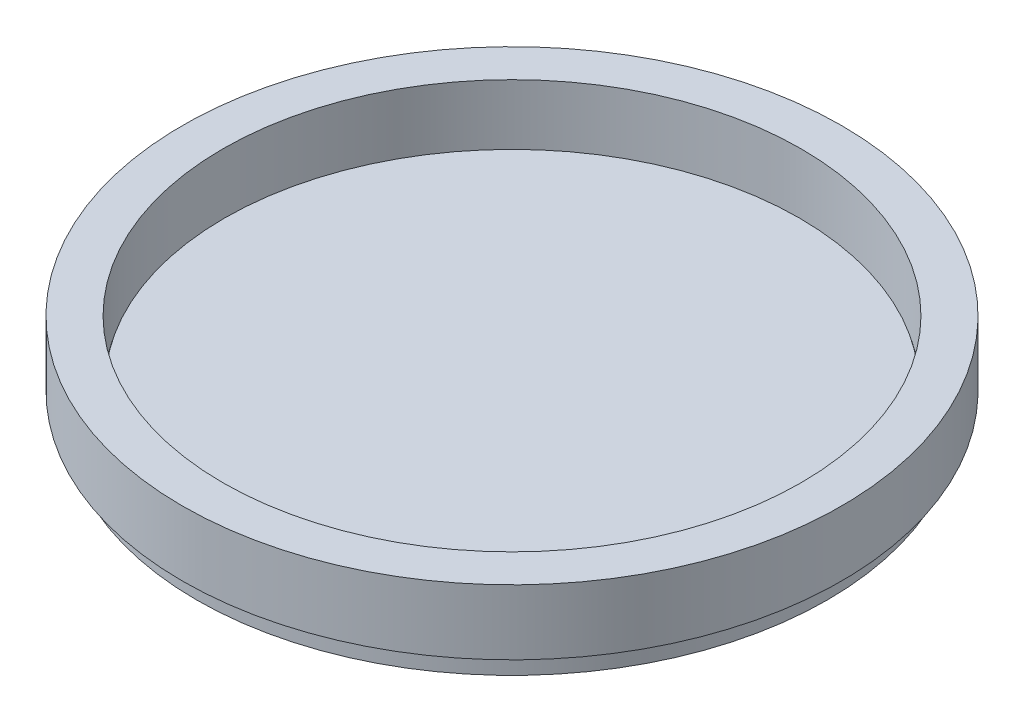
ISO-10303-21;
HEADER;
FILE_DESCRIPTION(('STEP AP214'),'2;1');
FILE_NAME('part.step','',(''),(''),'','','');
FILE_SCHEMA(('AUTOMOTIVE_DESIGN { 1 0 10303 214 1 1 1 1 }'));
ENDSEC;
DATA;
#1=APPLICATION_CONTEXT('core data for automotive mechanical design processes');
#2=APPLICATION_PROTOCOL_DEFINITION('international standard','automotive_design',2000,#1);
#3=PRODUCT_CONTEXT('',#1,'mechanical');
#4=PRODUCT('Part','Part','',(#3));
#5=PRODUCT_RELATED_PRODUCT_CATEGORY('part','',(#4));
#6=PRODUCT_DEFINITION_FORMATION('','',#4);
#7=PRODUCT_DEFINITION_CONTEXT('part definition',#1,'design');
#8=PRODUCT_DEFINITION('design','',#6,#7);
#9=PRODUCT_DEFINITION_SHAPE('','',#8);
#10=(LENGTH_UNIT() NAMED_UNIT(*) SI_UNIT(.MILLI.,.METRE.));
#11=(NAMED_UNIT(*) PLANE_ANGLE_UNIT() SI_UNIT($,.RADIAN.));
#12=(NAMED_UNIT(*) SI_UNIT($,.STERADIAN.) SOLID_ANGLE_UNIT());
#13=UNCERTAINTY_MEASURE_WITH_UNIT(LENGTH_MEASURE(1.E-05),#10,'distance_accuracy_value','');
#14=(GEOMETRIC_REPRESENTATION_CONTEXT(3) GLOBAL_UNCERTAINTY_ASSIGNED_CONTEXT((#13)) GLOBAL_UNIT_ASSIGNED_CONTEXT((#10,
#11,#12)) REPRESENTATION_CONTEXT('',''));
#15=CARTESIAN_POINT('',(0.,0.,0.));
#16=DIRECTION('',(0.,0.,1.));
#17=DIRECTION('',(1.,0.,0.));
#18=AXIS2_PLACEMENT_3D('',#15,#16,#17);
#19=CARTESIAN_POINT('',(0.,-2.04,0.));
#20=DIRECTION('',(0.,1.,0.));
#21=DIRECTION('',(0.,0.,1.));
#22=AXIS2_PLACEMENT_3D('',#19,#20,#21);
#23=CYLINDRICAL_SURFACE('',#22,24.94);
#24=CARTESIAN_POINT('',(0.,-2.04,0.));
#25=DIRECTION('',(0.,-1.,0.));
#26=DIRECTION('',(0.,0.,-1.));
#27=AXIS2_PLACEMENT_3D('',#24,#25,#26);
#28=CIRCLE('',#27,24.94);
#29=CARTESIAN_POINT('',(0.,-2.04,-24.94));
#30=VERTEX_POINT('',#29);
#31=EDGE_CURVE('E76',#30,#30,#28,.T.);
#32=ORIENTED_EDGE('',*,*,#31,.T.);
#33=EDGE_LOOP('',(#32));
#34=FACE_BOUND('',#33,.T.);
#35=CARTESIAN_POINT('',(0.,-0.5,0.));
#36=DIRECTION('',(0.,1.,0.));
#37=DIRECTION('',(0.,0.,1.));
#38=AXIS2_PLACEMENT_3D('',#35,#36,#37);
#39=CIRCLE('',#38,24.94);
#40=CARTESIAN_POINT('',(0.,-0.5,24.94));
#41=VERTEX_POINT('',#40);
#42=EDGE_CURVE('E74',#41,#41,#39,.T.);
#43=ORIENTED_EDGE('',*,*,#42,.T.);
#44=EDGE_LOOP('',(#43));
#45=FACE_BOUND('',#44,.T.);
#46=ADVANCED_FACE('F45',(#34,#45),#23,.F.);
#47=CARTESIAN_POINT('',(0.,5.65,0.));
#48=DIRECTION('',(0.,1.,0.));
#49=DIRECTION('',(0.,0.,1.));
#50=AXIS2_PLACEMENT_3D('',#47,#48,#49);
#51=PLANE('',#50);
#52=CARTESIAN_POINT('',(0.,5.65,0.));
#53=DIRECTION('',(0.,1.,0.));
#54=DIRECTION('',(0.,0.,1.));
#55=AXIS2_PLACEMENT_3D('',#52,#53,#54);
#56=CIRCLE('',#55,28.65);
#57=CARTESIAN_POINT('',(0.,5.65,28.65));
#58=VERTEX_POINT('',#57);
#59=EDGE_CURVE('E56',#58,#58,#56,.T.);
#60=ORIENTED_EDGE('',*,*,#59,.T.);
#61=EDGE_LOOP('',(#60));
#62=FACE_BOUND('',#61,.T.);
#63=CARTESIAN_POINT('',(0.,5.65,0.));
#64=DIRECTION('',(0.,1.,0.));
#65=DIRECTION('',(0.,0.,1.));
#66=AXIS2_PLACEMENT_3D('',#63,#64,#65);
#67=CIRCLE('',#66,25.14);
#68=CARTESIAN_POINT('',(0.,5.65,25.14));
#69=VERTEX_POINT('',#68);
#70=EDGE_CURVE('E67',#69,#69,#67,.T.);
#71=ORIENTED_EDGE('',*,*,#70,.F.);
#72=EDGE_LOOP('',(#71));
#73=FACE_BOUND('',#72,.T.);
#74=ADVANCED_FACE('F101',(#62,#73),#51,.T.);
#75=CARTESIAN_POINT('',(0.,0.,0.));
#76=DIRECTION('',(0.,1.,0.));
#77=DIRECTION('',(0.,0.,1.));
#78=AXIS2_PLACEMENT_3D('',#75,#76,#77);
#79=PLANE('',#78);
#80=CARTESIAN_POINT('',(0.,0.,0.));
#81=DIRECTION('',(0.,-1.,0.));
#82=DIRECTION('',(0.,0.,-1.));
#83=AXIS2_PLACEMENT_3D('',#80,#81,#82);
#84=CIRCLE('',#83,27.42);
#85=CARTESIAN_POINT('',(0.,0.,-27.42));
#86=VERTEX_POINT('',#85);
#87=EDGE_CURVE('E52',#86,#86,#84,.T.);
#88=ORIENTED_EDGE('',*,*,#87,.F.);
#89=EDGE_LOOP('',(#88));
#90=FACE_BOUND('',#89,.T.);
#91=CARTESIAN_POINT('',(0.,0.,0.));
#92=DIRECTION('',(0.,1.,0.));
#93=DIRECTION('',(0.,0.,1.));
#94=AXIS2_PLACEMENT_3D('',#91,#92,#93);
#95=CIRCLE('',#94,28.65);
#96=CARTESIAN_POINT('',(0.,0.,28.65));
#97=VERTEX_POINT('',#96);
#98=EDGE_CURVE('E61',#97,#97,#95,.T.);
#99=ORIENTED_EDGE('',*,*,#98,.F.);
#100=EDGE_LOOP('',(#99));
#101=FACE_BOUND('',#100,.T.);
#102=ADVANCED_FACE('F106',(#90,#101),#79,.F.);
#103=CARTESIAN_POINT('',(0.,5.65,0.));
#104=DIRECTION('',(0.,-1.,0.));
#105=DIRECTION('',(0.,0.,-1.));
#106=AXIS2_PLACEMENT_3D('',#103,#104,#105);
#107=CYLINDRICAL_SURFACE('',#106,28.65);
#108=ORIENTED_EDGE('',*,*,#59,.F.);
#109=EDGE_LOOP('',(#108));
#110=FACE_BOUND('',#109,.T.);
#111=ORIENTED_EDGE('',*,*,#98,.T.);
#112=EDGE_LOOP('',(#111));
#113=FACE_BOUND('',#112,.T.);
#114=ADVANCED_FACE('F47',(#110,#113),#107,.T.);
#115=CARTESIAN_POINT('',(0.,5.65,0.));
#116=DIRECTION('',(0.,-1.,0.));
#117=DIRECTION('',(0.,0.,-1.));
#118=AXIS2_PLACEMENT_3D('',#115,#116,#117);
#119=CYLINDRICAL_SURFACE('',#118,25.14);
#120=ORIENTED_EDGE('',*,*,#70,.T.);
#121=EDGE_LOOP('',(#120));
#122=FACE_BOUND('',#121,.T.);
#123=CARTESIAN_POINT('',(0.,0.,0.));
#124=DIRECTION('',(0.,1.,0.));
#125=DIRECTION('',(0.,0.,1.));
#126=AXIS2_PLACEMENT_3D('',#123,#124,#125);
#127=CIRCLE('',#126,25.14);
#128=CARTESIAN_POINT('',(0.,0.,25.14));
#129=VERTEX_POINT('',#128);
#130=EDGE_CURVE('E70',#129,#129,#127,.T.);
#131=ORIENTED_EDGE('',*,*,#130,.F.);
#132=EDGE_LOOP('',(#131));
#133=FACE_BOUND('',#132,.T.);
#134=ADVANCED_FACE('F117',(#122,#133),#119,.F.);
#135=CARTESIAN_POINT('',(0.,0.,0.));
#136=DIRECTION('',(0.,-1.,0.));
#137=DIRECTION('',(0.,0.,-1.));
#138=AXIS2_PLACEMENT_3D('',#135,#136,#137);
#139=PLANE('',#138);
#140=CARTESIAN_POINT('',(0.,0.,0.));
#141=DIRECTION('',(0.,-1.,0.));
#142=DIRECTION('',(0.,0.,-1.));
#143=AXIS2_PLACEMENT_3D('',#140,#141,#142);
#144=CIRCLE('',#143,25.);
#145=CARTESIAN_POINT('',(0.,0.,-25.));
#146=VERTEX_POINT('',#145);
#147=EDGE_CURVE('E10',#146,#146,#144,.F.);
#148=ORIENTED_EDGE('',*,*,#147,.F.);
#149=EDGE_LOOP('',(#148));
#150=FACE_BOUND('',#149,.T.);
#151=ORIENTED_EDGE('',*,*,#130,.T.);
#152=EDGE_LOOP('',(#151));
#153=FACE_BOUND('',#152,.T.);
#154=ADVANCED_FACE('F113',(#150,#153),#139,.F.);
#155=CARTESIAN_POINT('',(0.,-2.04,0.));
#156=DIRECTION('',(0.,-1.,0.));
#157=DIRECTION('',(0.,0.,-1.));
#158=AXIS2_PLACEMENT_3D('',#155,#156,#157);
#159=PLANE('',#158);
#160=CARTESIAN_POINT('',(0.,-2.04,0.));
#161=DIRECTION('',(0.,-1.,0.));
#162=DIRECTION('',(0.,0.,-1.));
#163=AXIS2_PLACEMENT_3D('',#160,#161,#162);
#164=CIRCLE('',#163,27.42);
#165=CARTESIAN_POINT('',(0.,-2.04,-27.42));
#166=VERTEX_POINT('',#165);
#167=EDGE_CURVE('E65',#166,#166,#164,.T.);
#168=ORIENTED_EDGE('',*,*,#167,.T.);
#169=EDGE_LOOP('',(#168));
#170=FACE_BOUND('',#169,.T.);
#171=ORIENTED_EDGE('',*,*,#31,.F.);
#172=EDGE_LOOP('',(#171));
#173=FACE_BOUND('',#172,.T.);
#174=ADVANCED_FACE('F110',(#170,#173),#159,.T.);
#175=CARTESIAN_POINT('',(0.,-2.04,0.));
#176=DIRECTION('',(0.,1.,0.));
#177=DIRECTION('',(0.,0.,1.));
#178=AXIS2_PLACEMENT_3D('',#175,#176,#177);
#179=CYLINDRICAL_SURFACE('',#178,27.42);
#180=ORIENTED_EDGE('',*,*,#167,.F.);
#181=EDGE_LOOP('',(#180));
#182=FACE_BOUND('',#181,.T.);
#183=ORIENTED_EDGE('',*,*,#87,.T.);
#184=EDGE_LOOP('',(#183));
#185=FACE_BOUND('',#184,.T.);
#186=ADVANCED_FACE('F96',(#182,#185),#179,.T.);
#187=CARTESIAN_POINT('',(0.,-0.5,0.));
#188=DIRECTION('',(0.,1.,0.));
#189=DIRECTION('',(0.,0.,1.));
#190=AXIS2_PLACEMENT_3D('',#187,#188,#189);
#191=PLANE('',#190);
#192=ORIENTED_EDGE('',*,*,#42,.F.);
#193=EDGE_LOOP('',(#192));
#194=FACE_BOUND('',#193,.T.);
#195=ADVANCED_FACE('F89',(#194),#191,.F.);
#196=CARTESIAN_POINT('',(0.,0.5,0.));
#197=DIRECTION('',(0.,-1.,0.));
#198=DIRECTION('',(0.,0.,-1.));
#199=AXIS2_PLACEMENT_3D('',#196,#197,#198);
#200=CYLINDRICAL_SURFACE('',#199,25.);
#201=CARTESIAN_POINT('',(0.,0.5,0.));
#202=DIRECTION('',(0.,1.,0.));
#203=DIRECTION('',(0.,0.,1.));
#204=AXIS2_PLACEMENT_3D('',#201,#202,#203);
#205=CIRCLE('',#204,25.);
#206=CARTESIAN_POINT('',(0.,0.5,25.));
#207=VERTEX_POINT('',#206);
#208=EDGE_CURVE('E77',#207,#207,#205,.T.);
#209=ORIENTED_EDGE('',*,*,#208,.F.);
#210=EDGE_LOOP('',(#209));
#211=FACE_BOUND('',#210,.T.);
#212=ORIENTED_EDGE('',*,*,#147,.T.);
#213=EDGE_LOOP('',(#212));
#214=FACE_BOUND('',#213,.T.);
#215=ADVANCED_FACE('F87',(#211,#214),#200,.T.);
#216=CARTESIAN_POINT('',(0.,0.5,0.));
#217=DIRECTION('',(0.,1.,0.));
#218=DIRECTION('',(0.,0.,1.));
#219=AXIS2_PLACEMENT_3D('',#216,#217,#218);
#220=PLANE('',#219);
#221=ORIENTED_EDGE('',*,*,#208,.T.);
#222=EDGE_LOOP('',(#221));
#223=FACE_BOUND('',#222,.T.);
#224=ADVANCED_FACE('F85',(#223),#220,.T.);
#225=CLOSED_SHELL('',(#46,#74,#102,#114,#134,#154,#174,#186,#195,#215,#224));
#226=MANIFOLD_SOLID_BREP('B2',#225);
#227=ADVANCED_BREP_SHAPE_REPRESENTATION('',(#18,#226),#14);
#228=SHAPE_DEFINITION_REPRESENTATION(#9,#227);
ENDSEC;
END-ISO-10303-21;
